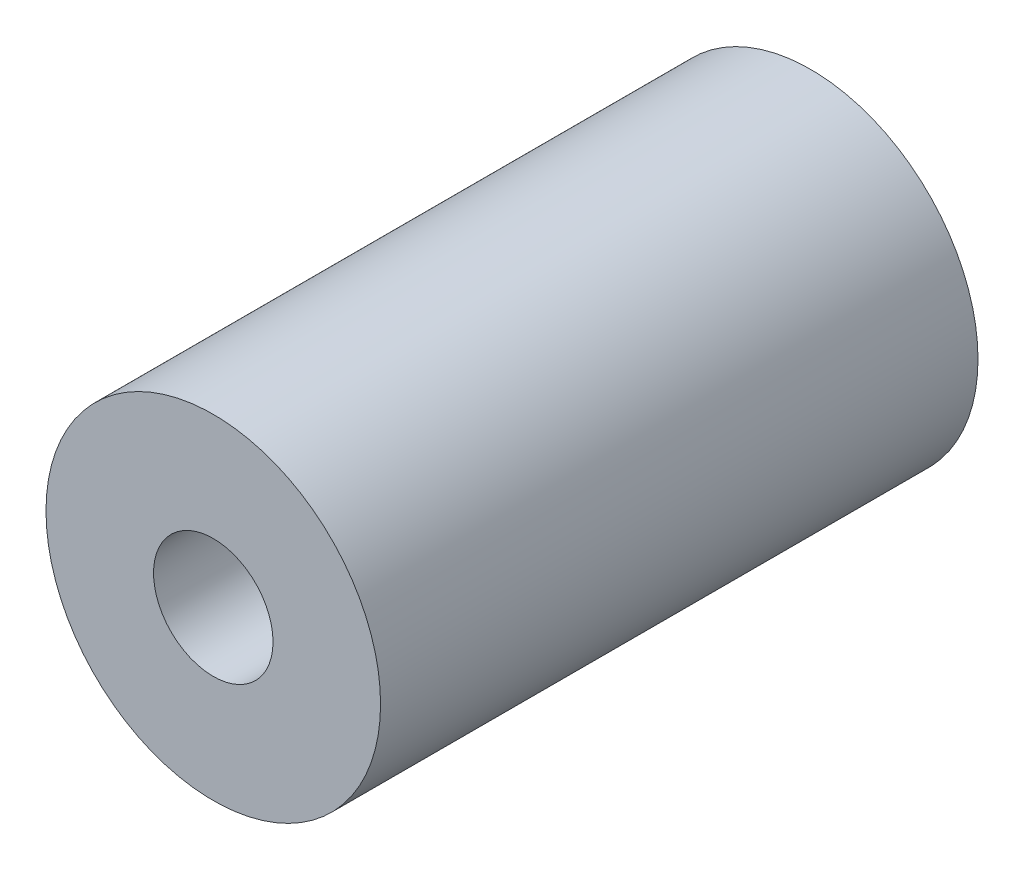
ISO-10303-21;
HEADER;
FILE_DESCRIPTION(('STEP AP214'),'2;1');
FILE_NAME('part.step','',(''),(''),'','','');
FILE_SCHEMA(('AUTOMOTIVE_DESIGN { 1 0 10303 214 1 1 1 1 }'));
ENDSEC;
DATA;
#1=APPLICATION_CONTEXT('core data for automotive mechanical design processes');
#2=APPLICATION_PROTOCOL_DEFINITION('international standard','automotive_design',2000,#1);
#3=PRODUCT_CONTEXT('',#1,'mechanical');
#4=PRODUCT('Part','Part','',(#3));
#5=PRODUCT_RELATED_PRODUCT_CATEGORY('part','',(#4));
#6=PRODUCT_DEFINITION_FORMATION('','',#4);
#7=PRODUCT_DEFINITION_CONTEXT('part definition',#1,'design');
#8=PRODUCT_DEFINITION('design','',#6,#7);
#9=PRODUCT_DEFINITION_SHAPE('','',#8);
#10=(LENGTH_UNIT() NAMED_UNIT(*) SI_UNIT(.MILLI.,.METRE.));
#11=(NAMED_UNIT(*) PLANE_ANGLE_UNIT() SI_UNIT($,.RADIAN.));
#12=(NAMED_UNIT(*) SI_UNIT($,.STERADIAN.) SOLID_ANGLE_UNIT());
#13=UNCERTAINTY_MEASURE_WITH_UNIT(LENGTH_MEASURE(1.E-05),#10,'distance_accuracy_value','');
#14=(GEOMETRIC_REPRESENTATION_CONTEXT(3) GLOBAL_UNCERTAINTY_ASSIGNED_CONTEXT((#13)) GLOBAL_UNIT_ASSIGNED_CONTEXT((#10,
#11,#12)) REPRESENTATION_CONTEXT('',''));
#15=CARTESIAN_POINT('',(0.,0.,0.));
#16=DIRECTION('',(0.,0.,1.));
#17=DIRECTION('',(1.,0.,0.));
#18=AXIS2_PLACEMENT_3D('',#15,#16,#17);
#19=CARTESIAN_POINT('',(0.,0.,12.5));
#20=DIRECTION('',(0.,0.,1.));
#21=DIRECTION('',(1.,0.,0.));
#22=AXIS2_PLACEMENT_3D('',#19,#20,#21);
#23=CYLINDRICAL_SURFACE('',#22,2.5);
#24=CARTESIAN_POINT('',(0.,0.,25.));
#25=DIRECTION('',(0.,0.,1.));
#26=DIRECTION('',(1.,0.,0.));
#27=AXIS2_PLACEMENT_3D('',#24,#25,#26);
#28=CIRCLE('',#27,2.5);
#29=CARTESIAN_POINT('',(2.5,0.,25.));
#30=VERTEX_POINT('',#29);
#31=EDGE_CURVE('E47',#30,#30,#28,.T.);
#32=ORIENTED_EDGE('',*,*,#31,.T.);
#33=EDGE_LOOP('',(#32));
#34=FACE_BOUND('',#33,.T.);
#35=CARTESIAN_POINT('',(0.,0.,15.));
#36=DIRECTION('',(0.,0.,-1.));
#37=DIRECTION('',(-1.,0.,0.));
#38=AXIS2_PLACEMENT_3D('',#35,#36,#37);
#39=CIRCLE('',#38,2.5);
#40=CARTESIAN_POINT('',(-2.5,0.,15.));
#41=VERTEX_POINT('',#40);
#42=EDGE_CURVE('E38',#41,#41,#39,.F.);
#43=ORIENTED_EDGE('',*,*,#42,.F.);
#44=EDGE_LOOP('',(#43));
#45=FACE_BOUND('',#44,.T.);
#46=ADVANCED_FACE('F34',(#34,#45),#23,.F.);
#47=CARTESIAN_POINT('',(0.,0.,25.));
#48=DIRECTION('',(0.,0.,-1.));
#49=DIRECTION('',(-1.,0.,0.));
#50=AXIS2_PLACEMENT_3D('',#47,#48,#49);
#51=CYLINDRICAL_SURFACE('',#50,7.);
#52=CARTESIAN_POINT('',(0.,0.,25.));
#53=DIRECTION('',(0.,0.,1.));
#54=DIRECTION('',(1.,0.,0.));
#55=AXIS2_PLACEMENT_3D('',#52,#53,#54);
#56=CIRCLE('',#55,7.);
#57=CARTESIAN_POINT('',(7.,0.,25.));
#58=VERTEX_POINT('',#57);
#59=EDGE_CURVE('E10',#58,#58,#56,.T.);
#60=ORIENTED_EDGE('',*,*,#59,.F.);
#61=EDGE_LOOP('',(#60));
#62=FACE_BOUND('',#61,.T.);
#63=CARTESIAN_POINT('',(0.,0.,0.));
#64=DIRECTION('',(0.,0.,1.));
#65=DIRECTION('',(1.,0.,0.));
#66=AXIS2_PLACEMENT_3D('',#63,#64,#65);
#67=CIRCLE('',#66,7.);
#68=CARTESIAN_POINT('',(7.,0.,0.));
#69=VERTEX_POINT('',#68);
#70=EDGE_CURVE('E42',#69,#69,#67,.T.);
#71=ORIENTED_EDGE('',*,*,#70,.T.);
#72=EDGE_LOOP('',(#71));
#73=FACE_BOUND('',#72,.T.);
#74=ADVANCED_FACE('F36',(#62,#73),#51,.T.);
#75=CARTESIAN_POINT('',(0.,0.,25.));
#76=DIRECTION('',(0.,0.,1.));
#77=DIRECTION('',(1.,0.,0.));
#78=AXIS2_PLACEMENT_3D('',#75,#76,#77);
#79=PLANE('',#78);
#80=ORIENTED_EDGE('',*,*,#31,.F.);
#81=EDGE_LOOP('',(#80));
#82=FACE_BOUND('',#81,.T.);
#83=ORIENTED_EDGE('',*,*,#59,.T.);
#84=EDGE_LOOP('',(#83));
#85=FACE_BOUND('',#84,.T.);
#86=ADVANCED_FACE('F69',(#82,#85),#79,.T.);
#87=CARTESIAN_POINT('',(0.,0.,0.));
#88=DIRECTION('',(0.,0.,1.));
#89=DIRECTION('',(1.,0.,0.));
#90=AXIS2_PLACEMENT_3D('',#87,#88,#89);
#91=PLANE('',#90);
#92=CARTESIAN_POINT('',(0.,0.,0.));
#93=DIRECTION('',(0.,0.,-1.));
#94=DIRECTION('',(-1.,0.,0.));
#95=AXIS2_PLACEMENT_3D('',#92,#93,#94);
#96=CIRCLE('',#95,4.);
#97=CARTESIAN_POINT('',(-4.,0.,0.));
#98=VERTEX_POINT('',#97);
#99=EDGE_CURVE('E51',#98,#98,#96,.T.);
#100=ORIENTED_EDGE('',*,*,#99,.F.);
#101=EDGE_LOOP('',(#100));
#102=FACE_BOUND('',#101,.T.);
#103=ORIENTED_EDGE('',*,*,#70,.F.);
#104=EDGE_LOOP('',(#103));
#105=FACE_BOUND('',#104,.T.);
#106=ADVANCED_FACE('F76',(#102,#105),#91,.F.);
#107=CARTESIAN_POINT('',(0.,0.,15.));
#108=DIRECTION('',(0.,0.,-1.));
#109=DIRECTION('',(-1.,0.,0.));
#110=AXIS2_PLACEMENT_3D('',#107,#108,#109);
#111=PLANE('',#110);
#112=CARTESIAN_POINT('',(0.,0.,15.));
#113=DIRECTION('',(0.,0.,-1.));
#114=DIRECTION('',(-1.,0.,0.));
#115=AXIS2_PLACEMENT_3D('',#112,#113,#114);
#116=CIRCLE('',#115,4.);
#117=CARTESIAN_POINT('',(-4.,0.,15.));
#118=VERTEX_POINT('',#117);
#119=EDGE_CURVE('E54',#118,#118,#116,.T.);
#120=ORIENTED_EDGE('',*,*,#119,.T.);
#121=EDGE_LOOP('',(#120));
#122=FACE_BOUND('',#121,.T.);
#123=ORIENTED_EDGE('',*,*,#42,.T.);
#124=EDGE_LOOP('',(#123));
#125=FACE_BOUND('',#124,.T.);
#126=ADVANCED_FACE('F61',(#122,#125),#111,.T.);
#127=CARTESIAN_POINT('',(0.,0.,15.));
#128=DIRECTION('',(0.,0.,-1.));
#129=DIRECTION('',(-1.,0.,0.));
#130=AXIS2_PLACEMENT_3D('',#127,#128,#129);
#131=CYLINDRICAL_SURFACE('',#130,4.);
#132=ORIENTED_EDGE('',*,*,#119,.F.);
#133=EDGE_LOOP('',(#132));
#134=FACE_BOUND('',#133,.T.);
#135=ORIENTED_EDGE('',*,*,#99,.T.);
#136=EDGE_LOOP('',(#135));
#137=FACE_BOUND('',#136,.T.);
#138=ADVANCED_FACE('F73',(#134,#137),#131,.F.);
#139=CLOSED_SHELL('',(#46,#74,#86,#106,#126,#138));
#140=MANIFOLD_SOLID_BREP('B2',#139);
#141=ADVANCED_BREP_SHAPE_REPRESENTATION('',(#18,#140),#14);
#142=SHAPE_DEFINITION_REPRESENTATION(#9,#141);
ENDSEC;
END-ISO-10303-21;
